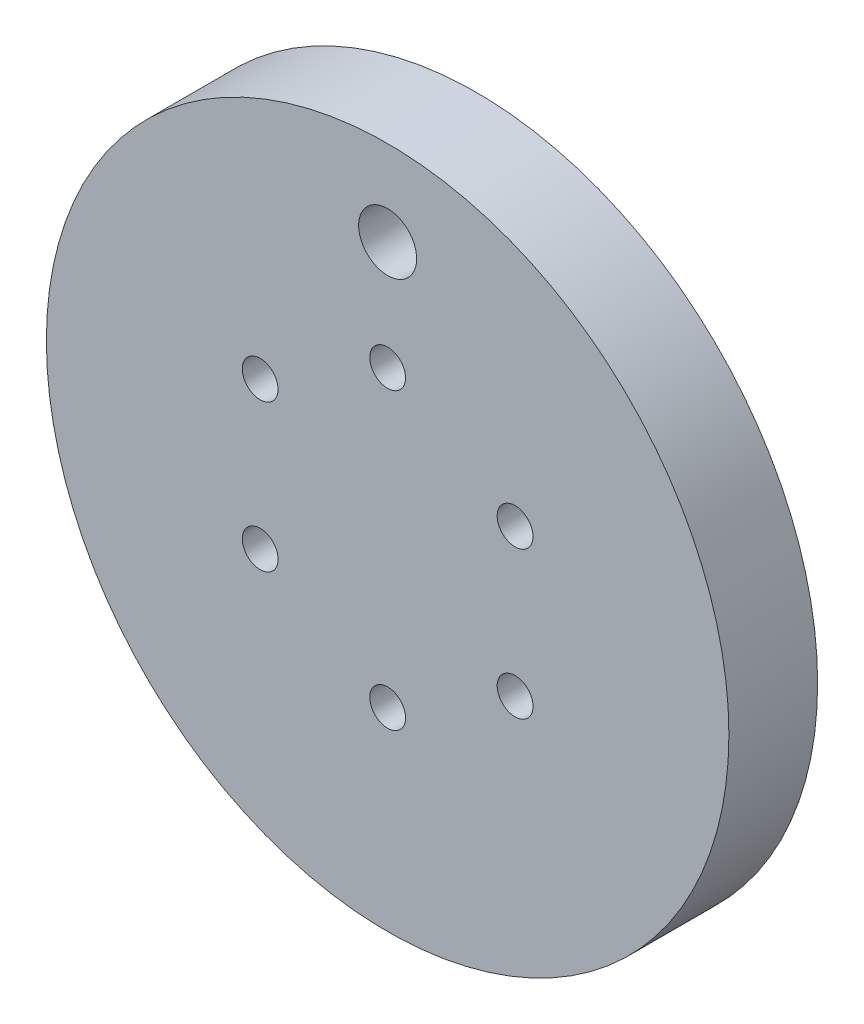
ISO-10303-21;
HEADER;
FILE_DESCRIPTION(('STEP AP214'),'2;1');
FILE_NAME('part.step','',(''),(''),'','','');
FILE_SCHEMA(('AUTOMOTIVE_DESIGN { 1 0 10303 214 1 1 1 1 }'));
ENDSEC;
DATA;
#1=APPLICATION_CONTEXT('core data for automotive mechanical design processes');
#2=APPLICATION_PROTOCOL_DEFINITION('international standard','automotive_design',2000,#1);
#3=PRODUCT_CONTEXT('',#1,'mechanical');
#4=PRODUCT('Part','Part','',(#3));
#5=PRODUCT_RELATED_PRODUCT_CATEGORY('part','',(#4));
#6=PRODUCT_DEFINITION_FORMATION('','',#4);
#7=PRODUCT_DEFINITION_CONTEXT('part definition',#1,'design');
#8=PRODUCT_DEFINITION('design','',#6,#7);
#9=PRODUCT_DEFINITION_SHAPE('','',#8);
#10=(LENGTH_UNIT() NAMED_UNIT(*) SI_UNIT(.MILLI.,.METRE.));
#11=(NAMED_UNIT(*) PLANE_ANGLE_UNIT() SI_UNIT($,.RADIAN.));
#12=(NAMED_UNIT(*) SI_UNIT($,.STERADIAN.) SOLID_ANGLE_UNIT());
#13=UNCERTAINTY_MEASURE_WITH_UNIT(LENGTH_MEASURE(1.E-05),#10,'distance_accuracy_value','');
#14=(GEOMETRIC_REPRESENTATION_CONTEXT(3) GLOBAL_UNCERTAINTY_ASSIGNED_CONTEXT((#13)) GLOBAL_UNIT_ASSIGNED_CONTEXT((#10,
#11,#12)) REPRESENTATION_CONTEXT('',''));
#15=CARTESIAN_POINT('',(0.,0.,0.));
#16=DIRECTION('',(0.,0.,1.));
#17=DIRECTION('',(1.,0.,0.));
#18=AXIS2_PLACEMENT_3D('',#15,#16,#17);
#19=CARTESIAN_POINT('',(0.,0.,-10.4));
#20=DIRECTION('',(0.,0.,-1.));
#21=DIRECTION('',(1.,0.,0.));
#22=AXIS2_PLACEMENT_3D('',#19,#20,#21);
#23=PLANE('',#22);
#24=CARTESIAN_POINT('',(0.,30.,-10.4));
#25=DIRECTION('',(0.,0.,1.));
#26=DIRECTION('',(1.,0.,0.));
#27=AXIS2_PLACEMENT_3D('',#24,#25,#26);
#28=CIRCLE('',#27,3.4);
#29=CARTESIAN_POINT('',(3.4,30.,-10.4));
#30=VERTEX_POINT('',#29);
#31=EDGE_CURVE('E106',#30,#30,#28,.T.);
#32=ORIENTED_EDGE('',*,*,#31,.T.);
#33=EDGE_LOOP('',(#32));
#34=FACE_BOUND('',#33,.T.);
#35=CARTESIAN_POINT('',(14.9389382152816,8.62500000000001,-10.4));
#36=DIRECTION('',(0.,0.,1.));
#37=DIRECTION('',(1.,0.,0.));
#38=AXIS2_PLACEMENT_3D('',#35,#36,#37);
#39=CIRCLE('',#38,2.1);
#40=CARTESIAN_POINT('',(17.0389382152816,8.62500000000001,-10.4));
#41=VERTEX_POINT('',#40);
#42=EDGE_CURVE('E88',#41,#41,#39,.T.);
#43=ORIENTED_EDGE('',*,*,#42,.T.);
#44=EDGE_LOOP('',(#43));
#45=FACE_BOUND('',#44,.T.);
#46=CARTESIAN_POINT('',(0.,-17.25,-10.4));
#47=DIRECTION('',(0.,0.,1.));
#48=DIRECTION('',(1.,0.,0.));
#49=AXIS2_PLACEMENT_3D('',#46,#47,#48);
#50=CIRCLE('',#49,2.1);
#51=CARTESIAN_POINT('',(2.1,-17.25,-10.4));
#52=VERTEX_POINT('',#51);
#53=EDGE_CURVE('E72',#52,#52,#50,.T.);
#54=ORIENTED_EDGE('',*,*,#53,.T.);
#55=EDGE_LOOP('',(#54));
#56=FACE_BOUND('',#55,.T.);
#57=CARTESIAN_POINT('',(-14.9389382152816,8.62499999999999,-10.4));
#58=DIRECTION('',(0.,0.,1.));
#59=DIRECTION('',(1.,0.,0.));
#60=AXIS2_PLACEMENT_3D('',#57,#58,#59);
#61=CIRCLE('',#60,2.1);
#62=CARTESIAN_POINT('',(-12.8389382152816,8.62499999999999,-10.4));
#63=VERTEX_POINT('',#62);
#64=EDGE_CURVE('E58',#63,#63,#61,.T.);
#65=ORIENTED_EDGE('',*,*,#64,.T.);
#66=EDGE_LOOP('',(#65));
#67=FACE_BOUND('',#66,.T.);
#68=CARTESIAN_POINT('',(0.,0.,-10.4));
#69=DIRECTION('',(0.,0.,1.));
#70=DIRECTION('',(1.,0.,0.));
#71=AXIS2_PLACEMENT_3D('',#68,#69,#70);
#72=CIRCLE('',#71,40.);
#73=CARTESIAN_POINT('',(40.,0.,-10.4));
#74=VERTEX_POINT('',#73);
#75=EDGE_CURVE('E10',#74,#74,#72,.T.);
#76=ORIENTED_EDGE('',*,*,#75,.F.);
#77=EDGE_LOOP('',(#76));
#78=FACE_BOUND('',#77,.T.);
#79=CARTESIAN_POINT('',(-14.9389382152816,-8.62500000000001,-10.4));
#80=DIRECTION('',(0.,0.,1.));
#81=DIRECTION('',(1.,0.,0.));
#82=AXIS2_PLACEMENT_3D('',#79,#80,#81);
#83=CIRCLE('',#82,2.1);
#84=CARTESIAN_POINT('',(-12.8389382152816,-8.62500000000001,-10.4));
#85=VERTEX_POINT('',#84);
#86=EDGE_CURVE('E64',#85,#85,#83,.T.);
#87=ORIENTED_EDGE('',*,*,#86,.T.);
#88=EDGE_LOOP('',(#87));
#89=FACE_BOUND('',#88,.T.);
#90=CARTESIAN_POINT('',(14.9389382152816,-8.625,-10.4));
#91=DIRECTION('',(0.,0.,1.));
#92=DIRECTION('',(1.,0.,0.));
#93=AXIS2_PLACEMENT_3D('',#90,#91,#92);
#94=CIRCLE('',#93,2.1);
#95=CARTESIAN_POINT('',(17.0389382152816,-8.625,-10.4));
#96=VERTEX_POINT('',#95);
#97=EDGE_CURVE('E80',#96,#96,#94,.T.);
#98=ORIENTED_EDGE('',*,*,#97,.T.);
#99=EDGE_LOOP('',(#98));
#100=FACE_BOUND('',#99,.T.);
#101=CARTESIAN_POINT('',(0.,17.25,-10.4));
#102=DIRECTION('',(0.,0.,1.));
#103=DIRECTION('',(1.,0.,0.));
#104=AXIS2_PLACEMENT_3D('',#101,#102,#103);
#105=CIRCLE('',#104,2.1);
#106=CARTESIAN_POINT('',(2.1,17.25,-10.4));
#107=VERTEX_POINT('',#106);
#108=EDGE_CURVE('E95',#107,#107,#105,.T.);
#109=ORIENTED_EDGE('',*,*,#108,.T.);
#110=EDGE_LOOP('',(#109));
#111=FACE_BOUND('',#110,.T.);
#112=ADVANCED_FACE('F43',(#34,#45,#56,#67,#78,#89,#100,#111),#23,.T.);
#113=CARTESIAN_POINT('',(0.,0.,0.));
#114=DIRECTION('',(0.,0.,-1.));
#115=DIRECTION('',(1.,0.,0.));
#116=AXIS2_PLACEMENT_3D('',#113,#114,#115);
#117=PLANE('',#116);
#118=CARTESIAN_POINT('',(0.,30.,0.));
#119=DIRECTION('',(0.,0.,1.));
#120=DIRECTION('',(1.,0.,0.));
#121=AXIS2_PLACEMENT_3D('',#118,#119,#120);
#122=CIRCLE('',#121,3.4);
#123=CARTESIAN_POINT('',(3.4,30.,0.));
#124=VERTEX_POINT('',#123);
#125=EDGE_CURVE('E102',#124,#124,#122,.T.);
#126=ORIENTED_EDGE('',*,*,#125,.F.);
#127=EDGE_LOOP('',(#126));
#128=FACE_BOUND('',#127,.T.);
#129=CARTESIAN_POINT('',(0.,0.,0.));
#130=DIRECTION('',(0.,0.,1.));
#131=DIRECTION('',(1.,0.,0.));
#132=AXIS2_PLACEMENT_3D('',#129,#130,#131);
#133=CIRCLE('',#132,40.);
#134=CARTESIAN_POINT('',(40.,0.,0.));
#135=VERTEX_POINT('',#134);
#136=EDGE_CURVE('E47',#135,#135,#133,.T.);
#137=ORIENTED_EDGE('',*,*,#136,.T.);
#138=EDGE_LOOP('',(#137));
#139=FACE_BOUND('',#138,.T.);
#140=CARTESIAN_POINT('',(-14.9389382152816,8.62499999999999,0.));
#141=DIRECTION('',(0.,0.,1.));
#142=DIRECTION('',(1.,0.,0.));
#143=AXIS2_PLACEMENT_3D('',#140,#141,#142);
#144=CIRCLE('',#143,2.1);
#145=CARTESIAN_POINT('',(-12.8389382152816,8.62499999999999,0.));
#146=VERTEX_POINT('',#145);
#147=EDGE_CURVE('E60',#146,#146,#144,.T.);
#148=ORIENTED_EDGE('',*,*,#147,.F.);
#149=EDGE_LOOP('',(#148));
#150=FACE_BOUND('',#149,.T.);
#151=CARTESIAN_POINT('',(-14.9389382152816,-8.62500000000001,0.));
#152=DIRECTION('',(0.,0.,1.));
#153=DIRECTION('',(1.,0.,0.));
#154=AXIS2_PLACEMENT_3D('',#151,#152,#153);
#155=CIRCLE('',#154,2.1);
#156=CARTESIAN_POINT('',(-12.8389382152816,-8.62500000000001,0.));
#157=VERTEX_POINT('',#156);
#158=EDGE_CURVE('E68',#157,#157,#155,.T.);
#159=ORIENTED_EDGE('',*,*,#158,.F.);
#160=EDGE_LOOP('',(#159));
#161=FACE_BOUND('',#160,.T.);
#162=CARTESIAN_POINT('',(0.,-17.25,0.));
#163=DIRECTION('',(0.,0.,1.));
#164=DIRECTION('',(1.,0.,0.));
#165=AXIS2_PLACEMENT_3D('',#162,#163,#164);
#166=CIRCLE('',#165,2.1);
#167=CARTESIAN_POINT('',(2.1,-17.25,0.));
#168=VERTEX_POINT('',#167);
#169=EDGE_CURVE('E76',#168,#168,#166,.T.);
#170=ORIENTED_EDGE('',*,*,#169,.F.);
#171=EDGE_LOOP('',(#170));
#172=FACE_BOUND('',#171,.T.);
#173=CARTESIAN_POINT('',(14.9389382152816,-8.625,0.));
#174=DIRECTION('',(0.,0.,1.));
#175=DIRECTION('',(1.,0.,0.));
#176=AXIS2_PLACEMENT_3D('',#173,#174,#175);
#177=CIRCLE('',#176,2.1);
#178=CARTESIAN_POINT('',(17.0389382152816,-8.625,0.));
#179=VERTEX_POINT('',#178);
#180=EDGE_CURVE('E84',#179,#179,#177,.T.);
#181=ORIENTED_EDGE('',*,*,#180,.F.);
#182=EDGE_LOOP('',(#181));
#183=FACE_BOUND('',#182,.T.);
#184=CARTESIAN_POINT('',(14.9389382152816,8.62500000000001,0.));
#185=DIRECTION('',(0.,0.,1.));
#186=DIRECTION('',(1.,0.,0.));
#187=AXIS2_PLACEMENT_3D('',#184,#185,#186);
#188=CIRCLE('',#187,2.1);
#189=CARTESIAN_POINT('',(17.0389382152816,8.62500000000001,0.));
#190=VERTEX_POINT('',#189);
#191=EDGE_CURVE('E91',#190,#190,#188,.T.);
#192=ORIENTED_EDGE('',*,*,#191,.F.);
#193=EDGE_LOOP('',(#192));
#194=FACE_BOUND('',#193,.T.);
#195=CARTESIAN_POINT('',(0.,17.25,0.));
#196=DIRECTION('',(0.,0.,1.));
#197=DIRECTION('',(1.,0.,0.));
#198=AXIS2_PLACEMENT_3D('',#195,#196,#197);
#199=CIRCLE('',#198,2.1);
#200=CARTESIAN_POINT('',(2.1,17.25,0.));
#201=VERTEX_POINT('',#200);
#202=EDGE_CURVE('E99',#201,#201,#199,.T.);
#203=ORIENTED_EDGE('',*,*,#202,.F.);
#204=EDGE_LOOP('',(#203));
#205=FACE_BOUND('',#204,.T.);
#206=ADVANCED_FACE('F117',(#128,#139,#150,#161,#172,#183,#194,#205),#117,.F.);
#207=CARTESIAN_POINT('',(0.,0.,-10.4));
#208=DIRECTION('',(0.,0.,1.));
#209=DIRECTION('',(-1.,0.,0.));
#210=AXIS2_PLACEMENT_3D('',#207,#208,#209);
#211=CYLINDRICAL_SURFACE('',#210,40.);
#212=ORIENTED_EDGE('',*,*,#75,.T.);
#213=EDGE_LOOP('',(#212));
#214=FACE_BOUND('',#213,.T.);
#215=ORIENTED_EDGE('',*,*,#136,.F.);
#216=EDGE_LOOP('',(#215));
#217=FACE_BOUND('',#216,.T.);
#218=ADVANCED_FACE('F45',(#214,#217),#211,.T.);
#219=CARTESIAN_POINT('',(-14.9389382152816,8.62499999999999,-10.4));
#220=DIRECTION('',(0.,0.,1.));
#221=DIRECTION('',(-1.,0.,0.));
#222=AXIS2_PLACEMENT_3D('',#219,#220,#221);
#223=CYLINDRICAL_SURFACE('',#222,2.1);
#224=ORIENTED_EDGE('',*,*,#64,.F.);
#225=EDGE_LOOP('',(#224));
#226=FACE_BOUND('',#225,.T.);
#227=ORIENTED_EDGE('',*,*,#147,.T.);
#228=EDGE_LOOP('',(#227));
#229=FACE_BOUND('',#228,.T.);
#230=ADVANCED_FACE('F155',(#226,#229),#223,.F.);
#231=CARTESIAN_POINT('',(-14.9389382152816,-8.62500000000001,-10.4));
#232=DIRECTION('',(0.,0.,1.));
#233=DIRECTION('',(-1.,0.,0.));
#234=AXIS2_PLACEMENT_3D('',#231,#232,#233);
#235=CYLINDRICAL_SURFACE('',#234,2.1);
#236=ORIENTED_EDGE('',*,*,#86,.F.);
#237=EDGE_LOOP('',(#236));
#238=FACE_BOUND('',#237,.T.);
#239=ORIENTED_EDGE('',*,*,#158,.T.);
#240=EDGE_LOOP('',(#239));
#241=FACE_BOUND('',#240,.T.);
#242=ADVANCED_FACE('F158',(#238,#241),#235,.F.);
#243=CARTESIAN_POINT('',(0.,-17.25,-10.4));
#244=DIRECTION('',(0.,0.,1.));
#245=DIRECTION('',(-1.,0.,0.));
#246=AXIS2_PLACEMENT_3D('',#243,#244,#245);
#247=CYLINDRICAL_SURFACE('',#246,2.1);
#248=ORIENTED_EDGE('',*,*,#53,.F.);
#249=EDGE_LOOP('',(#248));
#250=FACE_BOUND('',#249,.T.);
#251=ORIENTED_EDGE('',*,*,#169,.T.);
#252=EDGE_LOOP('',(#251));
#253=FACE_BOUND('',#252,.T.);
#254=ADVANCED_FACE('F162',(#250,#253),#247,.F.);
#255=CARTESIAN_POINT('',(14.9389382152816,-8.625,-10.4));
#256=DIRECTION('',(0.,0.,1.));
#257=DIRECTION('',(-1.,0.,0.));
#258=AXIS2_PLACEMENT_3D('',#255,#256,#257);
#259=CYLINDRICAL_SURFACE('',#258,2.1);
#260=ORIENTED_EDGE('',*,*,#97,.F.);
#261=EDGE_LOOP('',(#260));
#262=FACE_BOUND('',#261,.T.);
#263=ORIENTED_EDGE('',*,*,#180,.T.);
#264=EDGE_LOOP('',(#263));
#265=FACE_BOUND('',#264,.T.);
#266=ADVANCED_FACE('F144',(#262,#265),#259,.F.);
#267=CARTESIAN_POINT('',(14.9389382152816,8.62500000000001,-10.4));
#268=DIRECTION('',(0.,0.,1.));
#269=DIRECTION('',(-1.,0.,0.));
#270=AXIS2_PLACEMENT_3D('',#267,#268,#269);
#271=CYLINDRICAL_SURFACE('',#270,2.1);
#272=ORIENTED_EDGE('',*,*,#42,.F.);
#273=EDGE_LOOP('',(#272));
#274=FACE_BOUND('',#273,.T.);
#275=ORIENTED_EDGE('',*,*,#191,.T.);
#276=EDGE_LOOP('',(#275));
#277=FACE_BOUND('',#276,.T.);
#278=ADVANCED_FACE('F136',(#274,#277),#271,.F.);
#279=CARTESIAN_POINT('',(0.,17.25,-10.4));
#280=DIRECTION('',(0.,0.,1.));
#281=DIRECTION('',(-1.,0.,0.));
#282=AXIS2_PLACEMENT_3D('',#279,#280,#281);
#283=CYLINDRICAL_SURFACE('',#282,2.1);
#284=ORIENTED_EDGE('',*,*,#108,.F.);
#285=EDGE_LOOP('',(#284));
#286=FACE_BOUND('',#285,.T.);
#287=ORIENTED_EDGE('',*,*,#202,.T.);
#288=EDGE_LOOP('',(#287));
#289=FACE_BOUND('',#288,.T.);
#290=ADVANCED_FACE('F134',(#286,#289),#283,.F.);
#291=CARTESIAN_POINT('',(0.,30.,0.));
#292=DIRECTION('',(0.,0.,-1.));
#293=DIRECTION('',(1.,0.,0.));
#294=AXIS2_PLACEMENT_3D('',#291,#292,#293);
#295=CYLINDRICAL_SURFACE('',#294,3.4);
#296=ORIENTED_EDGE('',*,*,#125,.T.);
#297=EDGE_LOOP('',(#296));
#298=FACE_BOUND('',#297,.T.);
#299=ORIENTED_EDGE('',*,*,#31,.F.);
#300=EDGE_LOOP('',(#299));
#301=FACE_BOUND('',#300,.T.);
#302=ADVANCED_FACE('F114',(#298,#301),#295,.F.);
#303=CLOSED_SHELL('',(#112,#206,#218,#230,#242,#254,#266,#278,#290,#302));
#304=MANIFOLD_SOLID_BREP('B2',#303);
#305=ADVANCED_BREP_SHAPE_REPRESENTATION('',(#18,#304),#14);
#306=SHAPE_DEFINITION_REPRESENTATION(#9,#305);
ENDSEC;
END-ISO-10303-21;
